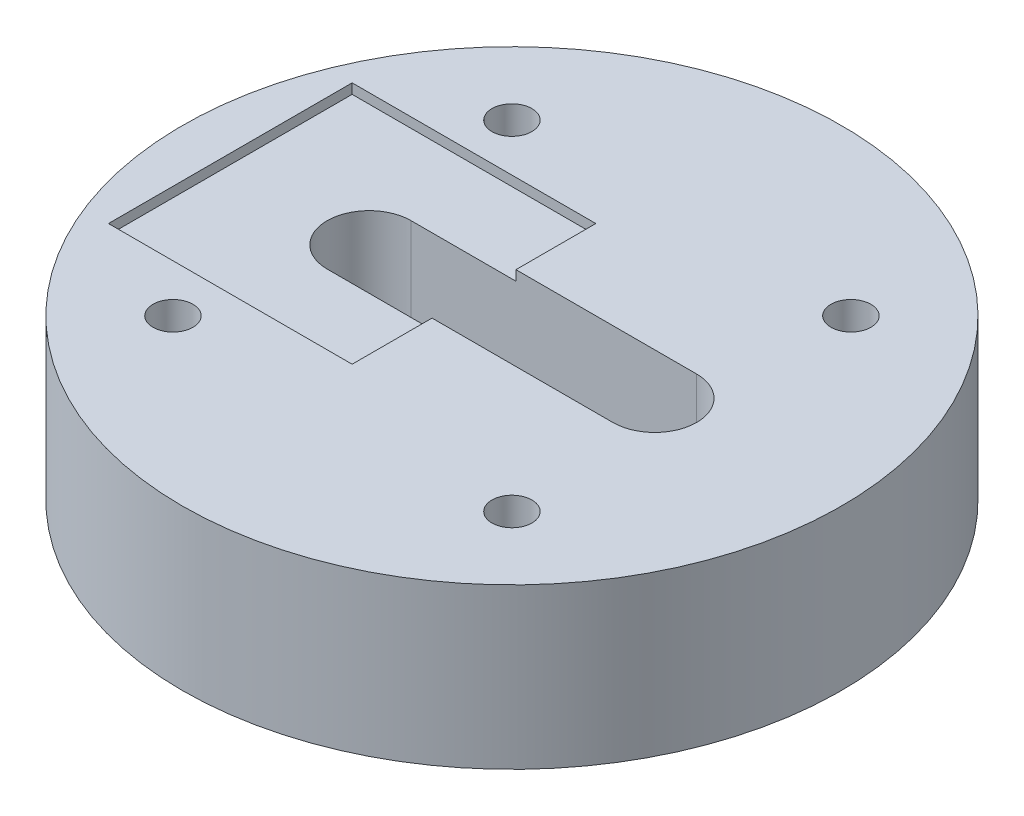
ISO-10303-21;
HEADER;
FILE_DESCRIPTION(('STEP AP214'),'2;1');
FILE_NAME('part.step','',(''),(''),'','','');
FILE_SCHEMA(('AUTOMOTIVE_DESIGN { 1 0 10303 214 1 1 1 1 }'));
ENDSEC;
DATA;
#1=APPLICATION_CONTEXT('core data for automotive mechanical design processes');
#2=APPLICATION_PROTOCOL_DEFINITION('international standard','automotive_design',2000,#1);
#3=PRODUCT_CONTEXT('',#1,'mechanical');
#4=PRODUCT('Part','Part','',(#3));
#5=PRODUCT_RELATED_PRODUCT_CATEGORY('part','',(#4));
#6=PRODUCT_DEFINITION_FORMATION('','',#4);
#7=PRODUCT_DEFINITION_CONTEXT('part definition',#1,'design');
#8=PRODUCT_DEFINITION('design','',#6,#7);
#9=PRODUCT_DEFINITION_SHAPE('','',#8);
#10=(LENGTH_UNIT() NAMED_UNIT(*) SI_UNIT(.MILLI.,.METRE.));
#11=(NAMED_UNIT(*) PLANE_ANGLE_UNIT() SI_UNIT($,.RADIAN.));
#12=(NAMED_UNIT(*) SI_UNIT($,.STERADIAN.) SOLID_ANGLE_UNIT());
#13=UNCERTAINTY_MEASURE_WITH_UNIT(LENGTH_MEASURE(1.E-05),#10,'distance_accuracy_value','');
#14=(GEOMETRIC_REPRESENTATION_CONTEXT(3) GLOBAL_UNCERTAINTY_ASSIGNED_CONTEXT((#13)) GLOBAL_UNIT_ASSIGNED_CONTEXT((#10,
#11,#12)) REPRESENTATION_CONTEXT('',''));
#15=CARTESIAN_POINT('',(0.,0.,0.));
#16=DIRECTION('',(0.,0.,1.));
#17=DIRECTION('',(1.,0.,0.));
#18=AXIS2_PLACEMENT_3D('',#15,#16,#17);
#19=CARTESIAN_POINT('',(0.,8.,0.));
#20=DIRECTION('',(0.,1.,0.));
#21=DIRECTION('',(0.,0.,1.));
#22=AXIS2_PLACEMENT_3D('',#19,#20,#21);
#23=PLANE('',#22);
#24=CARTESIAN_POINT('',(-8.48528137423865,8.,8.48528137423849));
#25=DIRECTION('',(0.,-1.,0.));
#26=DIRECTION('',(1.,0.,0.));
#27=AXIS2_PLACEMENT_3D('',#24,#25,#26);
#28=CIRCLE('',#27,1.);
#29=CARTESIAN_POINT('',(-7.48528137423864,8.,8.4852813742385));
#30=VERTEX_POINT('',#29);
#31=EDGE_CURVE('E382',#30,#30,#28,.T.);
#32=ORIENTED_EDGE('',*,*,#31,.T.);
#33=EDGE_LOOP('',(#32));
#34=FACE_BOUND('',#33,.T.);
#35=CARTESIAN_POINT('',(-8.48528137423852,8.,-8.48528137423862));
#36=DIRECTION('',(0.,-1.,0.));
#37=DIRECTION('',(0.,0.,1.));
#38=AXIS2_PLACEMENT_3D('',#35,#36,#37);
#39=CIRCLE('',#38,1.);
#40=CARTESIAN_POINT('',(-8.48528137423852,8.,-7.48528137423861));
#41=VERTEX_POINT('',#40);
#42=EDGE_CURVE('E377',#41,#41,#39,.T.);
#43=ORIENTED_EDGE('',*,*,#42,.T.);
#44=EDGE_LOOP('',(#43));
#45=FACE_BOUND('',#44,.T.);
#46=CARTESIAN_POINT('',(8.4852813742387,8.,-8.48528137423843));
#47=DIRECTION('',(0.,-1.,0.));
#48=DIRECTION('',(-1.,0.,0.));
#49=AXIS2_PLACEMENT_3D('',#46,#47,#48);
#50=CIRCLE('',#49,1.);
#51=CARTESIAN_POINT('',(7.4852813742387,8.,-8.48528137423845));
#52=VERTEX_POINT('',#51);
#53=EDGE_CURVE('E373',#52,#52,#50,.T.);
#54=ORIENTED_EDGE('',*,*,#53,.T.);
#55=EDGE_LOOP('',(#54));
#56=FACE_BOUND('',#55,.T.);
#57=CARTESIAN_POINT('',(8.48528137423852,8.,8.48528137423862));
#58=DIRECTION('',(0.,-1.,0.));
#59=DIRECTION('',(0.,0.,-1.));
#60=AXIS2_PLACEMENT_3D('',#57,#58,#59);
#61=CIRCLE('',#60,1.);
#62=CARTESIAN_POINT('',(8.48528137423852,8.,7.48528137423861));
#63=VERTEX_POINT('',#62);
#64=EDGE_CURVE('E363',#63,#63,#61,.T.);
#65=ORIENTED_EDGE('',*,*,#64,.T.);
#66=EDGE_LOOP('',(#65));
#67=FACE_BOUND('',#66,.T.);
#68=CARTESIAN_POINT('',(0.,8.,0.));
#69=DIRECTION('',(0.,1.,0.));
#70=DIRECTION('',(0.,0.,1.));
#71=AXIS2_PLACEMENT_3D('',#68,#69,#70);
#72=CIRCLE('',#71,16.5);
#73=CARTESIAN_POINT('',(0.,8.,16.5));
#74=VERTEX_POINT('',#73);
#75=EDGE_CURVE('E352',#74,#74,#72,.T.);
#76=ORIENTED_EDGE('',*,*,#75,.T.);
#77=EDGE_LOOP('',(#76));
#78=FACE_BOUND('',#77,.T.);
#79=DIRECTION('',(-1.,0.,0.));
#80=VECTOR('',#79,1.);
#81=CARTESIAN_POINT('',(4.25,8.,2.1));
#82=LINE('',#81,#80);
#83=CARTESIAN_POINT('',(7.15,8.,2.1));
#84=VERTEX_POINT('',#83);
#85=CARTESIAN_POINT('',(-1.90000000000001,8.,2.1));
#86=VERTEX_POINT('',#85);
#87=EDGE_CURVE('E321',#84,#86,#82,.T.);
#88=ORIENTED_EDGE('',*,*,#87,.T.);
#89=DIRECTION('',(0.,0.,1.));
#90=VECTOR('',#89,1.);
#91=CARTESIAN_POINT('',(-1.90000000000001,8.,-6.10000000000002));
#92=LINE('',#91,#90);
#93=CARTESIAN_POINT('',(-1.9,8.,6.10000000000002));
#94=VERTEX_POINT('',#93);
#95=EDGE_CURVE('E392',#86,#94,#92,.T.);
#96=ORIENTED_EDGE('',*,*,#95,.T.);
#97=DIRECTION('',(-1.,0.,0.));
#98=VECTOR('',#97,1.);
#99=CARTESIAN_POINT('',(-1.9,8.,6.10000000000002));
#100=LINE('',#99,#98);
#101=CARTESIAN_POINT('',(-14.1,8.,6.10000000000002));
#102=VERTEX_POINT('',#101);
#103=EDGE_CURVE('E267',#94,#102,#100,.T.);
#104=ORIENTED_EDGE('',*,*,#103,.T.);
#105=DIRECTION('',(0.,0.,1.));
#106=VECTOR('',#105,1.);
#107=CARTESIAN_POINT('',(-14.1,8.,-6.10000000000002));
#108=LINE('',#107,#106);
#109=CARTESIAN_POINT('',(-14.1,8.,-6.10000000000002));
#110=VERTEX_POINT('',#109);
#111=EDGE_CURVE('E403',#110,#102,#108,.T.);
#112=ORIENTED_EDGE('',*,*,#111,.F.);
#113=DIRECTION('',(-1.,0.,0.));
#114=VECTOR('',#113,1.);
#115=CARTESIAN_POINT('',(-1.90000000000001,8.,-6.10000000000002));
#116=LINE('',#115,#114);
#117=CARTESIAN_POINT('',(-1.90000000000001,8.,-6.10000000000002));
#118=VERTEX_POINT('',#117);
#119=EDGE_CURVE('E254',#118,#110,#116,.T.);
#120=ORIENTED_EDGE('',*,*,#119,.F.);
#121=CARTESIAN_POINT('',(-1.90000000000001,8.,-2.1));
#122=VERTEX_POINT('',#121);
#123=EDGE_CURVE('E399',#118,#122,#92,.T.);
#124=ORIENTED_EDGE('',*,*,#123,.T.);
#125=DIRECTION('',(-1.,0.,0.));
#126=VECTOR('',#125,1.);
#127=CARTESIAN_POINT('',(4.25,8.,-2.1));
#128=LINE('',#127,#126);
#129=CARTESIAN_POINT('',(7.15,8.,-2.1));
#130=VERTEX_POINT('',#129);
#131=EDGE_CURVE('E345',#130,#122,#128,.T.);
#132=ORIENTED_EDGE('',*,*,#131,.F.);
#133=CARTESIAN_POINT('',(7.15000000000001,8.,0.));
#134=DIRECTION('',(0.,1.,0.));
#135=DIRECTION('',(0.,0.,1.));
#136=AXIS2_PLACEMENT_3D('',#133,#134,#135);
#137=CIRCLE('',#136,2.1);
#138=EDGE_CURVE('E301',#84,#130,#137,.T.);
#139=ORIENTED_EDGE('',*,*,#138,.F.);
#140=EDGE_LOOP('',(#88,#96,#104,#112,#120,#124,#132,#139));
#141=FACE_BOUND('',#140,.T.);
#142=ADVANCED_FACE('F143',(#34,#45,#56,#67,#78,#141),#23,.T.);
#143=CARTESIAN_POINT('',(-4.25,0.,0.));
#144=DIRECTION('',(0.,1.,0.));
#145=DIRECTION('',(0.,0.,1.));
#146=AXIS2_PLACEMENT_3D('',#143,#144,#145);
#147=CYLINDRICAL_SURFACE('',#146,2.1);
#148=CARTESIAN_POINT('',(-4.25,2.,0.));
#149=DIRECTION('',(0.,1.,0.));
#150=DIRECTION('',(0.,0.,1.));
#151=AXIS2_PLACEMENT_3D('',#148,#149,#150);
#152=CIRCLE('',#151,2.1);
#153=CARTESIAN_POINT('',(-4.25,2.,2.1));
#154=VERTEX_POINT('',#153);
#155=CARTESIAN_POINT('',(-4.25,2.,-2.1));
#156=VERTEX_POINT('',#155);
#157=EDGE_CURVE('E319',#154,#156,#152,.F.);
#158=ORIENTED_EDGE('',*,*,#157,.F.);
#159=DIRECTION('',(0.,1.,0.));
#160=VECTOR('',#159,1.);
#161=CARTESIAN_POINT('',(-4.25,0.,2.1));
#162=LINE('',#161,#160);
#163=CARTESIAN_POINT('',(-4.25,0.,2.1));
#164=VERTEX_POINT('',#163);
#165=EDGE_CURVE('E327',#164,#154,#162,.T.);
#166=ORIENTED_EDGE('',*,*,#165,.F.);
#167=CARTESIAN_POINT('',(-4.25,0.,0.));
#168=DIRECTION('',(0.,1.,0.));
#169=DIRECTION('',(0.,0.,1.));
#170=AXIS2_PLACEMENT_3D('',#167,#168,#169);
#171=CIRCLE('',#170,2.1);
#172=CARTESIAN_POINT('',(-4.25,0.,-2.1));
#173=VERTEX_POINT('',#172);
#174=EDGE_CURVE('E322',#173,#164,#171,.T.);
#175=ORIENTED_EDGE('',*,*,#174,.F.);
#176=DIRECTION('',(0.,1.,0.));
#177=VECTOR('',#176,1.);
#178=CARTESIAN_POINT('',(-4.25,0.,-2.1));
#179=LINE('',#178,#177);
#180=EDGE_CURVE('E325',#173,#156,#179,.T.);
#181=ORIENTED_EDGE('',*,*,#180,.T.);
#182=EDGE_LOOP('',(#158,#166,#175,#181));
#183=FACE_BOUND('',#182,.T.);
#184=ADVANCED_FACE('F448',(#183),#147,.F.);
#185=CARTESIAN_POINT('',(4.25,0.,0.));
#186=DIRECTION('',(0.,1.,0.));
#187=DIRECTION('',(0.,0.,1.));
#188=AXIS2_PLACEMENT_3D('',#185,#186,#187);
#189=CYLINDRICAL_SURFACE('',#188,2.1);
#190=CARTESIAN_POINT('',(4.25,2.,0.));
#191=DIRECTION('',(0.,1.,0.));
#192=DIRECTION('',(0.,0.,1.));
#193=AXIS2_PLACEMENT_3D('',#190,#191,#192);
#194=CIRCLE('',#193,2.1);
#195=CARTESIAN_POINT('',(4.25,2.,-2.1));
#196=VERTEX_POINT('',#195);
#197=CARTESIAN_POINT('',(4.25,2.,2.1));
#198=VERTEX_POINT('',#197);
#199=EDGE_CURVE('E300',#196,#198,#194,.F.);
#200=ORIENTED_EDGE('',*,*,#199,.F.);
#201=DIRECTION('',(0.,1.,0.));
#202=VECTOR('',#201,1.);
#203=CARTESIAN_POINT('',(4.25,0.,-2.1));
#204=LINE('',#203,#202);
#205=CARTESIAN_POINT('',(4.25,0.,-2.1));
#206=VERTEX_POINT('',#205);
#207=EDGE_CURVE('E326',#206,#196,#204,.T.);
#208=ORIENTED_EDGE('',*,*,#207,.F.);
#209=CARTESIAN_POINT('',(4.25,0.,0.));
#210=DIRECTION('',(0.,1.,0.));
#211=DIRECTION('',(0.,0.,1.));
#212=AXIS2_PLACEMENT_3D('',#209,#210,#211);
#213=CIRCLE('',#212,2.1);
#214=CARTESIAN_POINT('',(4.25,0.,2.1));
#215=VERTEX_POINT('',#214);
#216=EDGE_CURVE('E333',#215,#206,#213,.T.);
#217=ORIENTED_EDGE('',*,*,#216,.F.);
#218=DIRECTION('',(0.,1.,0.));
#219=VECTOR('',#218,1.);
#220=CARTESIAN_POINT('',(4.25,0.,2.1));
#221=LINE('',#220,#219);
#222=EDGE_CURVE('E336',#215,#198,#221,.T.);
#223=ORIENTED_EDGE('',*,*,#222,.T.);
#224=EDGE_LOOP('',(#200,#208,#217,#223));
#225=FACE_BOUND('',#224,.T.);
#226=ADVANCED_FACE('F441',(#225),#189,.F.);
#227=CARTESIAN_POINT('',(0.,0.,0.));
#228=DIRECTION('',(0.,1.,0.));
#229=DIRECTION('',(0.,0.,1.));
#230=AXIS2_PLACEMENT_3D('',#227,#228,#229);
#231=PLANE('',#230);
#232=CARTESIAN_POINT('',(-8.48528137423865,0.,8.48528137423849));
#233=DIRECTION('',(0.,-1.,0.));
#234=DIRECTION('',(1.,0.,0.));
#235=AXIS2_PLACEMENT_3D('',#232,#233,#234);
#236=CIRCLE('',#235,1.5);
#237=CARTESIAN_POINT('',(-6.98528137423865,0.,8.4852813742385));
#238=VERTEX_POINT('',#237);
#239=EDGE_CURVE('E473',#238,#238,#236,.T.);
#240=ORIENTED_EDGE('',*,*,#239,.F.);
#241=EDGE_LOOP('',(#240));
#242=FACE_BOUND('',#241,.T.);
#243=CARTESIAN_POINT('',(-8.48528137423852,0.,-8.48528137423862));
#244=DIRECTION('',(0.,-1.,0.));
#245=DIRECTION('',(0.,0.,1.));
#246=AXIS2_PLACEMENT_3D('',#243,#244,#245);
#247=CIRCLE('',#246,1.5);
#248=CARTESIAN_POINT('',(-8.48528137423852,0.,-9.98528137423862));
#249=VERTEX_POINT('',#248);
#250=EDGE_CURVE('E477',#249,#249,#247,.T.);
#251=ORIENTED_EDGE('',*,*,#250,.F.);
#252=EDGE_LOOP('',(#251));
#253=FACE_BOUND('',#252,.T.);
#254=CARTESIAN_POINT('',(8.4852813742387,0.,-8.48528137423843));
#255=DIRECTION('',(0.,-1.,0.));
#256=DIRECTION('',(-1.,0.,0.));
#257=AXIS2_PLACEMENT_3D('',#254,#255,#256);
#258=CIRCLE('',#257,1.5);
#259=CARTESIAN_POINT('',(6.9852813742387,0.,-8.48528137423845));
#260=VERTEX_POINT('',#259);
#261=EDGE_CURVE('E481',#260,#260,#258,.T.);
#262=ORIENTED_EDGE('',*,*,#261,.F.);
#263=EDGE_LOOP('',(#262));
#264=FACE_BOUND('',#263,.T.);
#265=CARTESIAN_POINT('',(8.48528137423852,0.,8.48528137423862));
#266=DIRECTION('',(0.,-1.,0.));
#267=DIRECTION('',(0.,0.,-1.));
#268=AXIS2_PLACEMENT_3D('',#265,#266,#267);
#269=CIRCLE('',#268,1.5);
#270=CARTESIAN_POINT('',(8.48528137423852,0.,6.98528137423862));
#271=VERTEX_POINT('',#270);
#272=EDGE_CURVE('E386',#271,#271,#269,.T.);
#273=ORIENTED_EDGE('',*,*,#272,.F.);
#274=EDGE_LOOP('',(#273));
#275=FACE_BOUND('',#274,.T.);
#276=CARTESIAN_POINT('',(-7.69999999999998,0.,0.));
#277=DIRECTION('',(0.,1.,0.));
#278=DIRECTION('',(0.,0.,1.));
#279=AXIS2_PLACEMENT_3D('',#276,#277,#278);
#280=CIRCLE('',#279,0.4);
#281=CARTESIAN_POINT('',(-7.69999999999998,0.,0.400000000000003));
#282=VERTEX_POINT('',#281);
#283=EDGE_CURVE('E279',#282,#282,#280,.T.);
#284=ORIENTED_EDGE('',*,*,#283,.T.);
#285=EDGE_LOOP('',(#284));
#286=FACE_BOUND('',#285,.T.);
#287=CARTESIAN_POINT('',(7.70000000000002,0.,0.));
#288=DIRECTION('',(0.,1.,0.));
#289=DIRECTION('',(0.,0.,1.));
#290=AXIS2_PLACEMENT_3D('',#287,#288,#289);
#291=CIRCLE('',#290,0.4);
#292=CARTESIAN_POINT('',(7.70000000000002,0.,0.4));
#293=VERTEX_POINT('',#292);
#294=EDGE_CURVE('E278',#293,#293,#291,.T.);
#295=ORIENTED_EDGE('',*,*,#294,.T.);
#296=EDGE_LOOP('',(#295));
#297=FACE_BOUND('',#296,.T.);
#298=CARTESIAN_POINT('',(0.,0.,0.));
#299=DIRECTION('',(0.,1.,0.));
#300=DIRECTION('',(0.,0.,1.));
#301=AXIS2_PLACEMENT_3D('',#298,#299,#300);
#302=CIRCLE('',#301,16.5);
#303=CARTESIAN_POINT('',(0.,0.,16.5));
#304=VERTEX_POINT('',#303);
#305=EDGE_CURVE('E330',#304,#304,#302,.T.);
#306=ORIENTED_EDGE('',*,*,#305,.F.);
#307=EDGE_LOOP('',(#306));
#308=FACE_BOUND('',#307,.T.);
#309=DIRECTION('',(-1.,0.,0.));
#310=VECTOR('',#309,1.);
#311=CARTESIAN_POINT('',(4.25,0.,2.1));
#312=LINE('',#311,#310);
#313=EDGE_CURVE('E342',#215,#164,#312,.T.);
#314=ORIENTED_EDGE('',*,*,#313,.F.);
#315=ORIENTED_EDGE('',*,*,#216,.T.);
#316=DIRECTION('',(-1.,0.,0.));
#317=VECTOR('',#316,1.);
#318=CARTESIAN_POINT('',(4.25,0.,-2.1));
#319=LINE('',#318,#317);
#320=EDGE_CURVE('E337',#206,#173,#319,.T.);
#321=ORIENTED_EDGE('',*,*,#320,.T.);
#322=ORIENTED_EDGE('',*,*,#174,.T.);
#323=EDGE_LOOP('',(#314,#315,#321,#322));
#324=FACE_BOUND('',#323,.T.);
#325=ADVANCED_FACE('F446',(#242,#253,#264,#275,#286,#297,#308,#324),#231,.F.);
#326=CARTESIAN_POINT('',(0.,8.,0.));
#327=DIRECTION('',(0.,-1.,0.));
#328=DIRECTION('',(0.,0.,-1.));
#329=AXIS2_PLACEMENT_3D('',#326,#327,#328);
#330=CYLINDRICAL_SURFACE('',#329,16.5);
#331=ORIENTED_EDGE('',*,*,#75,.F.);
#332=EDGE_LOOP('',(#331));
#333=FACE_BOUND('',#332,.T.);
#334=ORIENTED_EDGE('',*,*,#305,.T.);
#335=EDGE_LOOP('',(#334));
#336=FACE_BOUND('',#335,.T.);
#337=ADVANCED_FACE('F145',(#333,#336),#330,.T.);
#338=CARTESIAN_POINT('',(4.25,0.,2.1));
#339=DIRECTION('',(0.,0.,-1.));
#340=DIRECTION('',(-1.,0.,0.));
#341=AXIS2_PLACEMENT_3D('',#338,#339,#340);
#342=PLANE('',#341);
#343=DIRECTION('',(-1.,0.,0.));
#344=VECTOR('',#343,1.);
#345=CARTESIAN_POINT('',(4.25,7.5,2.1));
#346=LINE('',#345,#344);
#347=CARTESIAN_POINT('',(-1.90000000000001,7.5,2.1));
#348=VERTEX_POINT('',#347);
#349=CARTESIAN_POINT('',(-7.15,7.5,2.1));
#350=VERTEX_POINT('',#349);
#351=EDGE_CURVE('E160',#348,#350,#346,.T.);
#352=ORIENTED_EDGE('',*,*,#351,.F.);
#353=DIRECTION('',(0.,1.,0.));
#354=VECTOR('',#353,1.);
#355=CARTESIAN_POINT('',(-1.90000000000001,0.,2.1));
#356=LINE('',#355,#354);
#357=EDGE_CURVE('E13',#348,#86,#356,.T.);
#358=ORIENTED_EDGE('',*,*,#357,.T.);
#359=ORIENTED_EDGE('',*,*,#87,.F.);
#360=DIRECTION('',(0.,1.,0.));
#361=VECTOR('',#360,1.);
#362=CARTESIAN_POINT('',(7.15,-14.9040263016408,2.1));
#363=LINE('',#362,#361);
#364=CARTESIAN_POINT('',(7.15000000000001,2.,2.1));
#365=VERTEX_POINT('',#364);
#366=EDGE_CURVE('E304',#365,#84,#363,.T.);
#367=ORIENTED_EDGE('',*,*,#366,.F.);
#368=DIRECTION('',(-1.,0.,0.));
#369=VECTOR('',#368,1.);
#370=CARTESIAN_POINT('',(-7.15,2.,2.1));
#371=LINE('',#370,#369);
#372=EDGE_CURVE('E305',#365,#198,#371,.T.);
#373=ORIENTED_EDGE('',*,*,#372,.T.);
#374=ORIENTED_EDGE('',*,*,#222,.F.);
#375=ORIENTED_EDGE('',*,*,#313,.T.);
#376=ORIENTED_EDGE('',*,*,#165,.T.);
#377=CARTESIAN_POINT('',(-7.15,2.,2.1));
#378=VERTEX_POINT('',#377);
#379=EDGE_CURVE('E315',#154,#378,#371,.T.);
#380=ORIENTED_EDGE('',*,*,#379,.T.);
#381=DIRECTION('',(0.,1.,0.));
#382=VECTOR('',#381,1.);
#383=CARTESIAN_POINT('',(-7.15,-14.9040263016408,2.1));
#384=LINE('',#383,#382);
#385=EDGE_CURVE('E290',#378,#350,#384,.T.);
#386=ORIENTED_EDGE('',*,*,#385,.T.);
#387=EDGE_LOOP('',(#352,#358,#359,#367,#373,#374,#375,#376,#380,#386));
#388=FACE_BOUND('',#387,.T.);
#389=ADVANCED_FACE('F419',(#388),#342,.T.);
#390=CARTESIAN_POINT('',(4.25,0.,-2.1));
#391=DIRECTION('',(0.,0.,-1.));
#392=DIRECTION('',(-1.,0.,0.));
#393=AXIS2_PLACEMENT_3D('',#390,#391,#392);
#394=PLANE('',#393);
#395=DIRECTION('',(0.,1.,0.));
#396=VECTOR('',#395,1.);
#397=CARTESIAN_POINT('',(-1.90000000000001,0.,-2.1));
#398=LINE('',#397,#396);
#399=CARTESIAN_POINT('',(-1.90000000000001,7.5,-2.1));
#400=VERTEX_POINT('',#399);
#401=EDGE_CURVE('E152',#400,#122,#398,.T.);
#402=ORIENTED_EDGE('',*,*,#401,.F.);
#403=DIRECTION('',(-1.,0.,0.));
#404=VECTOR('',#403,1.);
#405=CARTESIAN_POINT('',(4.25,7.5,-2.1));
#406=LINE('',#405,#404);
#407=CARTESIAN_POINT('',(-7.14999999999999,7.5,-2.1));
#408=VERTEX_POINT('',#407);
#409=EDGE_CURVE('E268',#400,#408,#406,.T.);
#410=ORIENTED_EDGE('',*,*,#409,.T.);
#411=DIRECTION('',(0.,1.,0.));
#412=VECTOR('',#411,1.);
#413=CARTESIAN_POINT('',(-7.15,-14.9040263016408,-2.1));
#414=LINE('',#413,#412);
#415=CARTESIAN_POINT('',(-7.15,2.,-2.1));
#416=VERTEX_POINT('',#415);
#417=EDGE_CURVE('E294',#416,#408,#414,.T.);
#418=ORIENTED_EDGE('',*,*,#417,.F.);
#419=DIRECTION('',(-1.,0.,0.));
#420=VECTOR('',#419,1.);
#421=CARTESIAN_POINT('',(-7.15,2.,-2.1));
#422=LINE('',#421,#420);
#423=EDGE_CURVE('E168',#156,#416,#422,.T.);
#424=ORIENTED_EDGE('',*,*,#423,.F.);
#425=ORIENTED_EDGE('',*,*,#180,.F.);
#426=ORIENTED_EDGE('',*,*,#320,.F.);
#427=ORIENTED_EDGE('',*,*,#207,.T.);
#428=CARTESIAN_POINT('',(7.15,2.,-2.1));
#429=VERTEX_POINT('',#428);
#430=EDGE_CURVE('E313',#429,#196,#422,.T.);
#431=ORIENTED_EDGE('',*,*,#430,.F.);
#432=DIRECTION('',(0.,1.,0.));
#433=VECTOR('',#432,1.);
#434=CARTESIAN_POINT('',(7.15,-14.9040263016408,-2.1));
#435=LINE('',#434,#433);
#436=EDGE_CURVE('E306',#429,#130,#435,.T.);
#437=ORIENTED_EDGE('',*,*,#436,.T.);
#438=ORIENTED_EDGE('',*,*,#131,.T.);
#439=EDGE_LOOP('',(#402,#410,#418,#424,#425,#426,#427,#431,#437,#438));
#440=FACE_BOUND('',#439,.T.);
#441=ADVANCED_FACE('F428',(#440),#394,.F.);
#442=CARTESIAN_POINT('',(0.,2.,0.));
#443=DIRECTION('',(0.,1.,0.));
#444=DIRECTION('',(0.,0.,1.));
#445=AXIS2_PLACEMENT_3D('',#442,#443,#444);
#446=PLANE('',#445);
#447=CARTESIAN_POINT('',(7.70000000000002,2.,0.));
#448=DIRECTION('',(0.,1.,0.));
#449=DIRECTION('',(0.,0.,1.));
#450=AXIS2_PLACEMENT_3D('',#447,#448,#449);
#451=CIRCLE('',#450,0.4);
#452=CARTESIAN_POINT('',(7.70000000000002,2.,0.4));
#453=VERTEX_POINT('',#452);
#454=EDGE_CURVE('E285',#453,#453,#451,.T.);
#455=ORIENTED_EDGE('',*,*,#454,.F.);
#456=EDGE_LOOP('',(#455));
#457=FACE_BOUND('',#456,.T.);
#458=ORIENTED_EDGE('',*,*,#199,.T.);
#459=ORIENTED_EDGE('',*,*,#372,.F.);
#460=CARTESIAN_POINT('',(7.15000000000001,2.,0.));
#461=DIRECTION('',(0.,1.,0.));
#462=DIRECTION('',(0.,0.,1.));
#463=AXIS2_PLACEMENT_3D('',#460,#461,#462);
#464=CIRCLE('',#463,2.1);
#465=EDGE_CURVE('E297',#429,#365,#464,.F.);
#466=ORIENTED_EDGE('',*,*,#465,.F.);
#467=ORIENTED_EDGE('',*,*,#430,.T.);
#468=EDGE_LOOP('',(#458,#459,#466,#467));
#469=FACE_BOUND('',#468,.T.);
#470=ADVANCED_FACE('F438',(#457,#469),#446,.T.);
#471=CARTESIAN_POINT('',(7.15000000000001,-14.9040263016408,0.));
#472=DIRECTION('',(0.,1.,0.));
#473=DIRECTION('',(0.,0.,1.));
#474=AXIS2_PLACEMENT_3D('',#471,#472,#473);
#475=CYLINDRICAL_SURFACE('',#474,2.1);
#476=ORIENTED_EDGE('',*,*,#465,.T.);
#477=ORIENTED_EDGE('',*,*,#366,.T.);
#478=ORIENTED_EDGE('',*,*,#138,.T.);
#479=ORIENTED_EDGE('',*,*,#436,.F.);
#480=EDGE_LOOP('',(#476,#477,#478,#479));
#481=FACE_BOUND('',#480,.T.);
#482=ADVANCED_FACE('F435',(#481),#475,.F.);
#483=CARTESIAN_POINT('',(-7.69999999999998,2.,0.));
#484=DIRECTION('',(0.,1.,0.));
#485=DIRECTION('',(0.,0.,1.));
#486=AXIS2_PLACEMENT_3D('',#483,#484,#485);
#487=CIRCLE('',#486,0.4);
#488=CARTESIAN_POINT('',(-7.69999999999998,2.,0.400000000000003));
#489=VERTEX_POINT('',#488);
#490=EDGE_CURVE('E282',#489,#489,#487,.T.);
#491=ORIENTED_EDGE('',*,*,#490,.F.);
#492=EDGE_LOOP('',(#491));
#493=FACE_BOUND('',#492,.T.);
#494=ORIENTED_EDGE('',*,*,#157,.T.);
#495=ORIENTED_EDGE('',*,*,#423,.T.);
#496=CARTESIAN_POINT('',(-7.14999999999999,2.,0.));
#497=DIRECTION('',(0.,1.,0.));
#498=DIRECTION('',(0.,0.,1.));
#499=AXIS2_PLACEMENT_3D('',#496,#497,#498);
#500=CIRCLE('',#499,2.1);
#501=EDGE_CURVE('E293',#378,#416,#500,.F.);
#502=ORIENTED_EDGE('',*,*,#501,.F.);
#503=ORIENTED_EDGE('',*,*,#379,.F.);
#504=EDGE_LOOP('',(#494,#495,#502,#503));
#505=FACE_BOUND('',#504,.T.);
#506=ADVANCED_FACE('F425',(#493,#505),#446,.T.);
#507=CARTESIAN_POINT('',(-7.14999999999999,-14.9040263016408,0.));
#508=DIRECTION('',(0.,1.,0.));
#509=DIRECTION('',(0.,0.,1.));
#510=AXIS2_PLACEMENT_3D('',#507,#508,#509);
#511=CYLINDRICAL_SURFACE('',#510,2.1);
#512=ORIENTED_EDGE('',*,*,#417,.T.);
#513=CARTESIAN_POINT('',(-7.14999999999999,7.5,0.));
#514=DIRECTION('',(0.,-1.,0.));
#515=DIRECTION('',(0.,0.,-1.));
#516=AXIS2_PLACEMENT_3D('',#513,#514,#515);
#517=CIRCLE('',#516,2.1);
#518=EDGE_CURVE('E355',#408,#350,#517,.F.);
#519=ORIENTED_EDGE('',*,*,#518,.T.);
#520=ORIENTED_EDGE('',*,*,#385,.F.);
#521=ORIENTED_EDGE('',*,*,#501,.T.);
#522=EDGE_LOOP('',(#512,#519,#520,#521));
#523=FACE_BOUND('',#522,.T.);
#524=ADVANCED_FACE('F423',(#523),#511,.F.);
#525=CARTESIAN_POINT('',(-7.69999999999998,0.,0.));
#526=DIRECTION('',(0.,1.,0.));
#527=DIRECTION('',(0.,0.,1.));
#528=AXIS2_PLACEMENT_3D('',#525,#526,#527);
#529=CYLINDRICAL_SURFACE('',#528,0.4);
#530=ORIENTED_EDGE('',*,*,#283,.F.);
#531=EDGE_LOOP('',(#530));
#532=FACE_BOUND('',#531,.T.);
#533=ORIENTED_EDGE('',*,*,#490,.T.);
#534=EDGE_LOOP('',(#533));
#535=FACE_BOUND('',#534,.T.);
#536=ADVANCED_FACE('F494',(#532,#535),#529,.F.);
#537=CARTESIAN_POINT('',(7.70000000000002,0.,0.));
#538=DIRECTION('',(0.,1.,0.));
#539=DIRECTION('',(0.,0.,1.));
#540=AXIS2_PLACEMENT_3D('',#537,#538,#539);
#541=CYLINDRICAL_SURFACE('',#540,0.4);
#542=ORIENTED_EDGE('',*,*,#294,.F.);
#543=EDGE_LOOP('',(#542));
#544=FACE_BOUND('',#543,.T.);
#545=ORIENTED_EDGE('',*,*,#454,.T.);
#546=EDGE_LOOP('',(#545));
#547=FACE_BOUND('',#546,.T.);
#548=ADVANCED_FACE('F491',(#544,#547),#541,.F.);
#549=CARTESIAN_POINT('',(-1.90000000000001,7.5,-6.10000000000002));
#550=DIRECTION('',(-1.,0.,0.));
#551=DIRECTION('',(0.,0.,1.));
#552=AXIS2_PLACEMENT_3D('',#549,#550,#551);
#553=PLANE('',#552);
#554=ORIENTED_EDGE('',*,*,#401,.T.);
#555=ORIENTED_EDGE('',*,*,#123,.F.);
#556=DIRECTION('',(0.,1.,0.));
#557=VECTOR('',#556,1.);
#558=CARTESIAN_POINT('',(-1.90000000000001,7.5,-6.10000000000002));
#559=LINE('',#558,#557);
#560=CARTESIAN_POINT('',(-1.90000000000001,7.5,-6.10000000000002));
#561=VERTEX_POINT('',#560);
#562=EDGE_CURVE('E398',#561,#118,#559,.T.);
#563=ORIENTED_EDGE('',*,*,#562,.F.);
#564=DIRECTION('',(0.,0.,1.));
#565=VECTOR('',#564,1.);
#566=CARTESIAN_POINT('',(-1.90000000000001,7.5,-6.10000000000002));
#567=LINE('',#566,#565);
#568=EDGE_CURVE('E253',#561,#400,#567,.T.);
#569=ORIENTED_EDGE('',*,*,#568,.T.);
#570=EDGE_LOOP('',(#554,#555,#563,#569));
#571=FACE_BOUND('',#570,.T.);
#572=ADVANCED_FACE('F431',(#571),#553,.T.);
#573=CARTESIAN_POINT('',(-14.1,7.5,-6.10000000000002));
#574=DIRECTION('',(-1.,0.,0.));
#575=DIRECTION('',(0.,0.,1.));
#576=AXIS2_PLACEMENT_3D('',#573,#574,#575);
#577=PLANE('',#576);
#578=ORIENTED_EDGE('',*,*,#111,.T.);
#579=DIRECTION('',(0.,1.,0.));
#580=VECTOR('',#579,1.);
#581=CARTESIAN_POINT('',(-14.1,7.5,6.10000000000002));
#582=LINE('',#581,#580);
#583=CARTESIAN_POINT('',(-14.1,7.5,6.10000000000002));
#584=VERTEX_POINT('',#583);
#585=EDGE_CURVE('E269',#584,#102,#582,.T.);
#586=ORIENTED_EDGE('',*,*,#585,.F.);
#587=DIRECTION('',(0.,0.,1.));
#588=VECTOR('',#587,1.);
#589=CARTESIAN_POINT('',(-14.1,7.5,-6.10000000000002));
#590=LINE('',#589,#588);
#591=CARTESIAN_POINT('',(-14.1,7.5,-6.10000000000002));
#592=VERTEX_POINT('',#591);
#593=EDGE_CURVE('E261',#592,#584,#590,.T.);
#594=ORIENTED_EDGE('',*,*,#593,.F.);
#595=DIRECTION('',(0.,1.,0.));
#596=VECTOR('',#595,1.);
#597=CARTESIAN_POINT('',(-14.1,7.5,-6.10000000000002));
#598=LINE('',#597,#596);
#599=EDGE_CURVE('E273',#592,#110,#598,.T.);
#600=ORIENTED_EDGE('',*,*,#599,.T.);
#601=EDGE_LOOP('',(#578,#586,#594,#600));
#602=FACE_BOUND('',#601,.T.);
#603=ADVANCED_FACE('F409',(#602),#577,.F.);
#604=CARTESIAN_POINT('',(-1.90000000000001,7.5,-6.10000000000002));
#605=DIRECTION('',(0.,0.,-1.));
#606=DIRECTION('',(-1.,0.,0.));
#607=AXIS2_PLACEMENT_3D('',#604,#605,#606);
#608=PLANE('',#607);
#609=ORIENTED_EDGE('',*,*,#119,.T.);
#610=ORIENTED_EDGE('',*,*,#599,.F.);
#611=DIRECTION('',(-1.,0.,0.));
#612=VECTOR('',#611,1.);
#613=CARTESIAN_POINT('',(-1.90000000000001,7.5,-6.10000000000002));
#614=LINE('',#613,#612);
#615=EDGE_CURVE('E396',#561,#592,#614,.T.);
#616=ORIENTED_EDGE('',*,*,#615,.F.);
#617=ORIENTED_EDGE('',*,*,#562,.T.);
#618=EDGE_LOOP('',(#609,#610,#616,#617));
#619=FACE_BOUND('',#618,.T.);
#620=ADVANCED_FACE('F414',(#619),#608,.F.);
#621=CARTESIAN_POINT('',(-1.9,7.5,6.10000000000002));
#622=DIRECTION('',(0.,0.,-1.));
#623=DIRECTION('',(-1.,0.,0.));
#624=AXIS2_PLACEMENT_3D('',#621,#622,#623);
#625=PLANE('',#624);
#626=ORIENTED_EDGE('',*,*,#103,.F.);
#627=DIRECTION('',(0.,1.,0.));
#628=VECTOR('',#627,1.);
#629=CARTESIAN_POINT('',(-1.9,7.5,6.10000000000002));
#630=LINE('',#629,#628);
#631=CARTESIAN_POINT('',(-1.9,7.5,6.10000000000002));
#632=VERTEX_POINT('',#631);
#633=EDGE_CURVE('E251',#632,#94,#630,.T.);
#634=ORIENTED_EDGE('',*,*,#633,.F.);
#635=DIRECTION('',(-1.,0.,0.));
#636=VECTOR('',#635,1.);
#637=CARTESIAN_POINT('',(-1.9,7.5,6.10000000000002));
#638=LINE('',#637,#636);
#639=EDGE_CURVE('E257',#632,#584,#638,.T.);
#640=ORIENTED_EDGE('',*,*,#639,.T.);
#641=ORIENTED_EDGE('',*,*,#585,.T.);
#642=EDGE_LOOP('',(#626,#634,#640,#641));
#643=FACE_BOUND('',#642,.T.);
#644=ADVANCED_FACE('F265',(#643),#625,.T.);
#645=CARTESIAN_POINT('',(0.,7.5,0.));
#646=DIRECTION('',(0.,-1.,0.));
#647=DIRECTION('',(0.,0.,-1.));
#648=AXIS2_PLACEMENT_3D('',#645,#646,#647);
#649=PLANE('',#648);
#650=ORIENTED_EDGE('',*,*,#351,.T.);
#651=ORIENTED_EDGE('',*,*,#518,.F.);
#652=ORIENTED_EDGE('',*,*,#409,.F.);
#653=ORIENTED_EDGE('',*,*,#568,.F.);
#654=ORIENTED_EDGE('',*,*,#615,.T.);
#655=ORIENTED_EDGE('',*,*,#593,.T.);
#656=ORIENTED_EDGE('',*,*,#639,.F.);
#657=EDGE_CURVE('E247',#348,#632,#567,.T.);
#658=ORIENTED_EDGE('',*,*,#657,.F.);
#659=EDGE_LOOP('',(#650,#651,#652,#653,#654,#655,#656,#658));
#660=FACE_BOUND('',#659,.T.);
#661=ADVANCED_FACE('F258',(#660),#649,.F.);
#662=ORIENTED_EDGE('',*,*,#657,.T.);
#663=ORIENTED_EDGE('',*,*,#633,.T.);
#664=ORIENTED_EDGE('',*,*,#95,.F.);
#665=ORIENTED_EDGE('',*,*,#357,.F.);
#666=EDGE_LOOP('',(#662,#663,#664,#665));
#667=FACE_BOUND('',#666,.T.);
#668=ADVANCED_FACE('F249',(#667),#553,.T.);
#669=CARTESIAN_POINT('',(8.48528137423852,8.,8.48528137423862));
#670=DIRECTION('',(0.,-1.,0.));
#671=DIRECTION('',(0.,0.,-1.));
#672=AXIS2_PLACEMENT_3D('',#669,#670,#671);
#673=CYLINDRICAL_SURFACE('',#672,1.);
#674=CARTESIAN_POINT('',(8.48528137423852,6.,8.48528137423862));
#675=DIRECTION('',(0.,1.,0.));
#676=DIRECTION('',(0.,0.,1.));
#677=AXIS2_PLACEMENT_3D('',#674,#675,#676);
#678=CIRCLE('',#677,1.);
#679=CARTESIAN_POINT('',(8.48528137423852,6.,9.48528137423862));
#680=VERTEX_POINT('',#679);
#681=EDGE_CURVE('E360',#680,#680,#678,.F.);
#682=ORIENTED_EDGE('',*,*,#681,.T.);
#683=EDGE_LOOP('',(#682));
#684=FACE_BOUND('',#683,.T.);
#685=ORIENTED_EDGE('',*,*,#64,.F.);
#686=EDGE_LOOP('',(#685));
#687=FACE_BOUND('',#686,.T.);
#688=ADVANCED_FACE('F518',(#684,#687),#673,.F.);
#689=CARTESIAN_POINT('',(0.,6.,0.));
#690=DIRECTION('',(0.,1.,0.));
#691=DIRECTION('',(0.,0.,1.));
#692=AXIS2_PLACEMENT_3D('',#689,#690,#691);
#693=PLANE('',#692);
#694=CARTESIAN_POINT('',(8.48528137423852,6.,8.48528137423862));
#695=DIRECTION('',(0.,1.,0.));
#696=DIRECTION('',(0.,0.,1.));
#697=AXIS2_PLACEMENT_3D('',#694,#695,#696);
#698=CIRCLE('',#697,1.5);
#699=CARTESIAN_POINT('',(8.48528137423852,6.,6.98528137423862));
#700=VERTEX_POINT('',#699);
#701=EDGE_CURVE('E364',#700,#700,#698,.F.);
#702=ORIENTED_EDGE('',*,*,#701,.T.);
#703=EDGE_LOOP('',(#702));
#704=FACE_BOUND('',#703,.T.);
#705=ORIENTED_EDGE('',*,*,#681,.F.);
#706=EDGE_LOOP('',(#705));
#707=FACE_BOUND('',#706,.T.);
#708=ADVANCED_FACE('F529',(#704,#707),#693,.F.);
#709=CARTESIAN_POINT('',(8.48528137423852,12.2426406871193,8.48528137423862));
#710=DIRECTION('',(0.,-1.,0.));
#711=DIRECTION('',(0.,0.,-1.));
#712=AXIS2_PLACEMENT_3D('',#709,#710,#711);
#713=CYLINDRICAL_SURFACE('',#712,1.5);
#714=CARTESIAN_POINT('',(8.48528137423852,0.,6.98528137423862));
#715=CARTESIAN_POINT('',(8.48528137423852,0.0625000000000018,6.98528137423862));
#716=CARTESIAN_POINT('',(8.48528137423852,0.125000000000002,6.98528137423862));
#717=CARTESIAN_POINT('',(8.48528137423852,0.250000000000002,6.98528137423862));
#718=CARTESIAN_POINT('',(8.48528137423852,0.312500000000002,6.98528137423862));
#719=CARTESIAN_POINT('',(8.48528137423852,0.437500000000002,6.98528137423862));
#720=CARTESIAN_POINT('',(8.48528137423852,0.500000000000002,6.98528137423862));
#721=CARTESIAN_POINT('',(8.48528137423852,0.625000000000002,6.98528137423862));
#722=CARTESIAN_POINT('',(8.48528137423852,0.687500000000002,6.98528137423862));
#723=CARTESIAN_POINT('',(8.48528137423852,0.812500000000002,6.98528137423862));
#724=CARTESIAN_POINT('',(8.48528137423852,0.875000000000001,6.98528137423862));
#725=CARTESIAN_POINT('',(8.48528137423852,1.,6.98528137423862));
#726=CARTESIAN_POINT('',(8.48528137423852,1.0625,6.98528137423862));
#727=CARTESIAN_POINT('',(8.48528137423852,1.1875,6.98528137423862));
#728=CARTESIAN_POINT('',(8.48528137423852,1.25,6.98528137423862));
#729=CARTESIAN_POINT('',(8.48528137423852,1.375,6.98528137423862));
#730=CARTESIAN_POINT('',(8.48528137423852,1.4375,6.98528137423862));
#731=CARTESIAN_POINT('',(8.48528137423852,1.5625,6.98528137423862));
#732=CARTESIAN_POINT('',(8.48528137423852,1.625,6.98528137423862));
#733=CARTESIAN_POINT('',(8.48528137423852,1.75,6.98528137423862));
#734=CARTESIAN_POINT('',(8.48528137423852,1.8125,6.98528137423862));
#735=CARTESIAN_POINT('',(8.48528137423852,1.9375,6.98528137423862));
#736=CARTESIAN_POINT('',(8.48528137423852,2.,6.98528137423862));
#737=CARTESIAN_POINT('',(8.48528137423852,2.125,6.98528137423862));
#738=CARTESIAN_POINT('',(8.48528137423852,2.1875,6.98528137423862));
#739=CARTESIAN_POINT('',(8.48528137423852,2.3125,6.98528137423862));
#740=CARTESIAN_POINT('',(8.48528137423852,2.375,6.98528137423862));
#741=CARTESIAN_POINT('',(8.48528137423852,2.5,6.98528137423862));
#742=CARTESIAN_POINT('',(8.48528137423852,2.5625,6.98528137423862));
#743=CARTESIAN_POINT('',(8.48528137423852,2.6875,6.98528137423862));
#744=CARTESIAN_POINT('',(8.48528137423852,2.75,6.98528137423862));
#745=CARTESIAN_POINT('',(8.48528137423852,2.875,6.98528137423862));
#746=CARTESIAN_POINT('',(8.48528137423852,2.9375,6.98528137423862));
#747=CARTESIAN_POINT('',(8.48528137423852,3.0625,6.98528137423862));
#748=CARTESIAN_POINT('',(8.48528137423852,3.125,6.98528137423862));
#749=CARTESIAN_POINT('',(8.48528137423852,3.25,6.98528137423862));
#750=CARTESIAN_POINT('',(8.48528137423852,3.3125,6.98528137423862));
#751=CARTESIAN_POINT('',(8.48528137423852,3.4375,6.98528137423862));
#752=CARTESIAN_POINT('',(8.48528137423852,3.5,6.98528137423862));
#753=CARTESIAN_POINT('',(8.48528137423852,3.625,6.98528137423862));
#754=CARTESIAN_POINT('',(8.48528137423852,3.6875,6.98528137423862));
#755=CARTESIAN_POINT('',(8.48528137423852,3.8125,6.98528137423862));
#756=CARTESIAN_POINT('',(8.48528137423852,3.875,6.98528137423862));
#757=CARTESIAN_POINT('',(8.48528137423852,4.,6.98528137423862));
#758=CARTESIAN_POINT('',(8.48528137423852,4.0625,6.98528137423862));
#759=CARTESIAN_POINT('',(8.48528137423852,4.1875,6.98528137423862));
#760=CARTESIAN_POINT('',(8.48528137423852,4.25,6.98528137423862));
#761=CARTESIAN_POINT('',(8.48528137423852,4.375,6.98528137423862));
#762=CARTESIAN_POINT('',(8.48528137423852,4.4375,6.98528137423862));
#763=CARTESIAN_POINT('',(8.48528137423852,4.5625,6.98528137423862));
#764=CARTESIAN_POINT('',(8.48528137423852,4.625,6.98528137423862));
#765=CARTESIAN_POINT('',(8.48528137423852,4.75,6.98528137423862));
#766=CARTESIAN_POINT('',(8.48528137423852,4.8125,6.98528137423862));
#767=CARTESIAN_POINT('',(8.48528137423852,4.9375,6.98528137423862));
#768=CARTESIAN_POINT('',(8.48528137423852,5.,6.98528137423862));
#769=CARTESIAN_POINT('',(8.48528137423852,5.125,6.98528137423862));
#770=CARTESIAN_POINT('',(8.48528137423852,5.1875,6.98528137423862));
#771=CARTESIAN_POINT('',(8.48528137423852,5.3125,6.98528137423862));
#772=CARTESIAN_POINT('',(8.48528137423852,5.375,6.98528137423862));
#773=CARTESIAN_POINT('',(8.48528137423852,5.5,6.98528137423862));
#774=CARTESIAN_POINT('',(8.48528137423852,5.5625,6.98528137423862));
#775=CARTESIAN_POINT('',(8.48528137423852,5.6875,6.98528137423862));
#776=CARTESIAN_POINT('',(8.48528137423852,5.75,6.98528137423862));
#777=CARTESIAN_POINT('',(8.48528137423852,5.875,6.98528137423862));
#778=CARTESIAN_POINT('',(8.48528137423852,5.9375,6.98528137423862));
#779=CARTESIAN_POINT('',(8.48528137423852,6.,6.98528137423862));
#780=B_SPLINE_CURVE_WITH_KNOTS('',3,(#714,#715,#716,#717,#718,#719,#720,#721,#722,#723,#724,
#725,#726,#727,#728,#729,#730,#731,#732,#733,#734,#735,#736,#737,#738,#739,#740,#741,#742,#743,
#744,#745,#746,#747,#748,#749,#750,#751,#752,#753,#754,#755,#756,#757,#758,#759,#760,#761,#762,
#763,#764,#765,#766,#767,#768,#769,#770,#771,#772,#773,#774,#775,#776,#777,#778,#779),
.UNSPECIFIED.,.F.,.F.,(4,2,2,2,2,2,2,2,2,2,2,2,2,2,2,2,2,2,2,2,2,2,2,2,2,2,2,2,2,2,2,2,4),(0.,
0.1875,0.375,0.5625,0.750000000000001,0.937499999999999,1.125,1.3125,1.5,1.6875,1.875,2.0625,
2.25,2.4375,2.625,2.8125,3.,3.1875,3.375,3.5625,3.75,3.9375,4.125,4.3125,4.5,4.6875,4.875,
5.0625,5.25,5.4375,5.625,5.8125,6.),.UNSPECIFIED.);
#781=EDGE_CURVE('BSEAM533',#271,#700,#780,.T.);
#782=ORIENTED_EDGE('',*,*,#272,.T.);
#783=ORIENTED_EDGE('',*,*,#701,.F.);
#784=ORIENTED_EDGE('',*,*,#781,.T.);
#785=ORIENTED_EDGE('',*,*,#781,.F.);
#786=EDGE_LOOP('',(#782,#784,#783,#785));
#787=FACE_BOUND('',#786,.T.);
#788=ADVANCED_FACE('F533',(#787),#713,.F.);
#789=CARTESIAN_POINT('',(8.4852813742387,8.,-8.48528137423843));
#790=DIRECTION('',(0.,-1.,0.));
#791=DIRECTION('',(0.,0.,-1.));
#792=AXIS2_PLACEMENT_3D('',#789,#790,#791);
#793=CYLINDRICAL_SURFACE('',#792,1.);
#794=CARTESIAN_POINT('',(8.4852813742387,6.,-8.48528137423843));
#795=DIRECTION('',(0.,1.,0.));
#796=DIRECTION('',(0.,0.,1.));
#797=AXIS2_PLACEMENT_3D('',#794,#795,#796);
#798=CIRCLE('',#797,1.);
#799=CARTESIAN_POINT('',(8.4852813742387,6.,-7.48528137423843));
#800=VERTEX_POINT('',#799);
#801=EDGE_CURVE('E147',#800,#800,#798,.F.);
#802=ORIENTED_EDGE('',*,*,#801,.T.);
#803=EDGE_LOOP('',(#802));
#804=FACE_BOUND('',#803,.T.);
#805=ORIENTED_EDGE('',*,*,#53,.F.);
#806=EDGE_LOOP('',(#805));
#807=FACE_BOUND('',#806,.T.);
#808=ADVANCED_FACE('F537',(#804,#807),#793,.F.);
#809=CARTESIAN_POINT('',(-8.48528137423852,8.,-8.48528137423862));
#810=DIRECTION('',(0.,-1.,0.));
#811=DIRECTION('',(0.,0.,-1.));
#812=AXIS2_PLACEMENT_3D('',#809,#810,#811);
#813=CYLINDRICAL_SURFACE('',#812,1.);
#814=CARTESIAN_POINT('',(-8.48528137423852,6.,-8.48528137423862));
#815=DIRECTION('',(0.,1.,0.));
#816=DIRECTION('',(0.,0.,1.));
#817=AXIS2_PLACEMENT_3D('',#814,#815,#816);
#818=CIRCLE('',#817,1.);
#819=CARTESIAN_POINT('',(-8.48528137423852,6.,-7.48528137423861));
#820=VERTEX_POINT('',#819);
#821=EDGE_CURVE('E367',#820,#820,#818,.F.);
#822=ORIENTED_EDGE('',*,*,#821,.T.);
#823=EDGE_LOOP('',(#822));
#824=FACE_BOUND('',#823,.T.);
#825=ORIENTED_EDGE('',*,*,#42,.F.);
#826=EDGE_LOOP('',(#825));
#827=FACE_BOUND('',#826,.T.);
#828=ADVANCED_FACE('F541',(#824,#827),#813,.F.);
#829=CARTESIAN_POINT('',(-8.48528137423865,8.,8.48528137423849));
#830=DIRECTION('',(0.,-1.,0.));
#831=DIRECTION('',(0.,0.,-1.));
#832=AXIS2_PLACEMENT_3D('',#829,#830,#831);
#833=CYLINDRICAL_SURFACE('',#832,1.);
#834=CARTESIAN_POINT('',(-8.48528137423865,6.,8.48528137423849));
#835=DIRECTION('',(0.,1.,0.));
#836=DIRECTION('',(0.,0.,1.));
#837=AXIS2_PLACEMENT_3D('',#834,#835,#836);
#838=CIRCLE('',#837,1.);
#839=CARTESIAN_POINT('',(-8.48528137423865,6.,9.4852813742385));
#840=VERTEX_POINT('',#839);
#841=EDGE_CURVE('E365',#840,#840,#838,.F.);
#842=ORIENTED_EDGE('',*,*,#841,.T.);
#843=EDGE_LOOP('',(#842));
#844=FACE_BOUND('',#843,.T.);
#845=ORIENTED_EDGE('',*,*,#31,.F.);
#846=EDGE_LOOP('',(#845));
#847=FACE_BOUND('',#846,.T.);
#848=ADVANCED_FACE('F544',(#844,#847),#833,.F.);
#849=CARTESIAN_POINT('',(0.,6.,0.));
#850=DIRECTION('',(0.,1.,0.));
#851=DIRECTION('',(0.,0.,1.));
#852=AXIS2_PLACEMENT_3D('',#849,#850,#851);
#853=PLANE('',#852);
#854=CARTESIAN_POINT('',(-8.48528137423865,6.,8.48528137423849));
#855=DIRECTION('',(0.,1.,0.));
#856=DIRECTION('',(0.,0.,1.));
#857=AXIS2_PLACEMENT_3D('',#854,#855,#856);
#858=CIRCLE('',#857,1.5);
#859=CARTESIAN_POINT('',(-8.48528137423865,6.,9.98528137423849));
#860=VERTEX_POINT('',#859);
#861=EDGE_CURVE('E368',#860,#860,#858,.F.);
#862=ORIENTED_EDGE('',*,*,#861,.T.);
#863=EDGE_LOOP('',(#862));
#864=FACE_BOUND('',#863,.T.);
#865=ORIENTED_EDGE('',*,*,#841,.F.);
#866=EDGE_LOOP('',(#865));
#867=FACE_BOUND('',#866,.T.);
#868=ADVANCED_FACE('F547',(#864,#867),#853,.F.);
#869=CARTESIAN_POINT('',(-8.48528137423865,12.2426406871193,8.48528137423849));
#870=DIRECTION('',(0.,-1.,0.));
#871=DIRECTION('',(0.,0.,-1.));
#872=AXIS2_PLACEMENT_3D('',#869,#870,#871);
#873=CYLINDRICAL_SURFACE('',#872,1.5);
#874=ORIENTED_EDGE('',*,*,#239,.T.);
#875=EDGE_LOOP('',(#874));
#876=FACE_BOUND('',#875,.T.);
#877=ORIENTED_EDGE('',*,*,#861,.F.);
#878=EDGE_LOOP('',(#877));
#879=FACE_BOUND('',#878,.T.);
#880=ADVANCED_FACE('F561',(#876,#879),#873,.F.);
#881=CARTESIAN_POINT('',(0.,6.,0.));
#882=DIRECTION('',(0.,1.,0.));
#883=DIRECTION('',(0.,0.,1.));
#884=AXIS2_PLACEMENT_3D('',#881,#882,#883);
#885=PLANE('',#884);
#886=CARTESIAN_POINT('',(-8.48528137423852,6.,-8.48528137423862));
#887=DIRECTION('',(0.,1.,0.));
#888=DIRECTION('',(0.,0.,1.));
#889=AXIS2_PLACEMENT_3D('',#886,#887,#888);
#890=CIRCLE('',#889,1.5);
#891=CARTESIAN_POINT('',(-8.48528137423852,6.,-9.98528137423862));
#892=VERTEX_POINT('',#891);
#893=EDGE_CURVE('E577',#892,#892,#890,.F.);
#894=ORIENTED_EDGE('',*,*,#893,.T.);
#895=EDGE_LOOP('',(#894));
#896=FACE_BOUND('',#895,.T.);
#897=ORIENTED_EDGE('',*,*,#821,.F.);
#898=EDGE_LOOP('',(#897));
#899=FACE_BOUND('',#898,.T.);
#900=ADVANCED_FACE('F558',(#896,#899),#885,.F.);
#901=CARTESIAN_POINT('',(-8.48528137423852,12.2426406871193,-8.48528137423862));
#902=DIRECTION('',(0.,-1.,0.));
#903=DIRECTION('',(0.,0.,-1.));
#904=AXIS2_PLACEMENT_3D('',#901,#902,#903);
#905=CYLINDRICAL_SURFACE('',#904,1.5);
#906=CARTESIAN_POINT('',(-8.48528137423852,0.,-9.98528137423862));
#907=CARTESIAN_POINT('',(-8.48528137423852,0.0625000000000018,-9.98528137423862));
#908=CARTESIAN_POINT('',(-8.48528137423852,0.125000000000002,-9.98528137423862));
#909=CARTESIAN_POINT('',(-8.48528137423852,0.250000000000002,-9.98528137423862));
#910=CARTESIAN_POINT('',(-8.48528137423852,0.312500000000002,-9.98528137423862));
#911=CARTESIAN_POINT('',(-8.48528137423852,0.437500000000002,-9.98528137423862));
#912=CARTESIAN_POINT('',(-8.48528137423852,0.500000000000002,-9.98528137423862));
#913=CARTESIAN_POINT('',(-8.48528137423852,0.625000000000002,-9.98528137423862));
#914=CARTESIAN_POINT('',(-8.48528137423852,0.687500000000002,-9.98528137423862));
#915=CARTESIAN_POINT('',(-8.48528137423852,0.812500000000002,-9.98528137423862));
#916=CARTESIAN_POINT('',(-8.48528137423852,0.875000000000001,-9.98528137423862));
#917=CARTESIAN_POINT('',(-8.48528137423852,1.,-9.98528137423862));
#918=CARTESIAN_POINT('',(-8.48528137423852,1.0625,-9.98528137423862));
#919=CARTESIAN_POINT('',(-8.48528137423852,1.1875,-9.98528137423862));
#920=CARTESIAN_POINT('',(-8.48528137423852,1.25,-9.98528137423862));
#921=CARTESIAN_POINT('',(-8.48528137423852,1.375,-9.98528137423862));
#922=CARTESIAN_POINT('',(-8.48528137423852,1.4375,-9.98528137423862));
#923=CARTESIAN_POINT('',(-8.48528137423852,1.5625,-9.98528137423862));
#924=CARTESIAN_POINT('',(-8.48528137423852,1.625,-9.98528137423862));
#925=CARTESIAN_POINT('',(-8.48528137423852,1.75,-9.98528137423862));
#926=CARTESIAN_POINT('',(-8.48528137423852,1.8125,-9.98528137423862));
#927=CARTESIAN_POINT('',(-8.48528137423852,1.9375,-9.98528137423862));
#928=CARTESIAN_POINT('',(-8.48528137423852,2.,-9.98528137423862));
#929=CARTESIAN_POINT('',(-8.48528137423852,2.125,-9.98528137423862));
#930=CARTESIAN_POINT('',(-8.48528137423852,2.1875,-9.98528137423862));
#931=CARTESIAN_POINT('',(-8.48528137423852,2.3125,-9.98528137423862));
#932=CARTESIAN_POINT('',(-8.48528137423852,2.375,-9.98528137423862));
#933=CARTESIAN_POINT('',(-8.48528137423852,2.5,-9.98528137423862));
#934=CARTESIAN_POINT('',(-8.48528137423852,2.5625,-9.98528137423862));
#935=CARTESIAN_POINT('',(-8.48528137423852,2.6875,-9.98528137423862));
#936=CARTESIAN_POINT('',(-8.48528137423852,2.75,-9.98528137423862));
#937=CARTESIAN_POINT('',(-8.48528137423852,2.875,-9.98528137423862));
#938=CARTESIAN_POINT('',(-8.48528137423852,2.9375,-9.98528137423862));
#939=CARTESIAN_POINT('',(-8.48528137423852,3.0625,-9.98528137423862));
#940=CARTESIAN_POINT('',(-8.48528137423852,3.125,-9.98528137423862));
#941=CARTESIAN_POINT('',(-8.48528137423852,3.25,-9.98528137423862));
#942=CARTESIAN_POINT('',(-8.48528137423852,3.3125,-9.98528137423862));
#943=CARTESIAN_POINT('',(-8.48528137423852,3.4375,-9.98528137423862));
#944=CARTESIAN_POINT('',(-8.48528137423852,3.5,-9.98528137423862));
#945=CARTESIAN_POINT('',(-8.48528137423852,3.625,-9.98528137423862));
#946=CARTESIAN_POINT('',(-8.48528137423852,3.6875,-9.98528137423862));
#947=CARTESIAN_POINT('',(-8.48528137423852,3.8125,-9.98528137423862));
#948=CARTESIAN_POINT('',(-8.48528137423852,3.875,-9.98528137423862));
#949=CARTESIAN_POINT('',(-8.48528137423852,4.,-9.98528137423862));
#950=CARTESIAN_POINT('',(-8.48528137423852,4.0625,-9.98528137423862));
#951=CARTESIAN_POINT('',(-8.48528137423852,4.1875,-9.98528137423862));
#952=CARTESIAN_POINT('',(-8.48528137423852,4.25,-9.98528137423862));
#953=CARTESIAN_POINT('',(-8.48528137423852,4.375,-9.98528137423862));
#954=CARTESIAN_POINT('',(-8.48528137423852,4.4375,-9.98528137423862));
#955=CARTESIAN_POINT('',(-8.48528137423852,4.5625,-9.98528137423862));
#956=CARTESIAN_POINT('',(-8.48528137423852,4.625,-9.98528137423862));
#957=CARTESIAN_POINT('',(-8.48528137423852,4.75,-9.98528137423862));
#958=CARTESIAN_POINT('',(-8.48528137423852,4.8125,-9.98528137423862));
#959=CARTESIAN_POINT('',(-8.48528137423852,4.9375,-9.98528137423862));
#960=CARTESIAN_POINT('',(-8.48528137423852,5.,-9.98528137423862));
#961=CARTESIAN_POINT('',(-8.48528137423852,5.125,-9.98528137423862));
#962=CARTESIAN_POINT('',(-8.48528137423852,5.1875,-9.98528137423862));
#963=CARTESIAN_POINT('',(-8.48528137423852,5.3125,-9.98528137423862));
#964=CARTESIAN_POINT('',(-8.48528137423852,5.375,-9.98528137423862));
#965=CARTESIAN_POINT('',(-8.48528137423852,5.5,-9.98528137423862));
#966=CARTESIAN_POINT('',(-8.48528137423852,5.5625,-9.98528137423862));
#967=CARTESIAN_POINT('',(-8.48528137423852,5.6875,-9.98528137423862));
#968=CARTESIAN_POINT('',(-8.48528137423852,5.75,-9.98528137423862));
#969=CARTESIAN_POINT('',(-8.48528137423852,5.875,-9.98528137423862));
#970=CARTESIAN_POINT('',(-8.48528137423852,5.9375,-9.98528137423862));
#971=CARTESIAN_POINT('',(-8.48528137423852,6.,-9.98528137423862));
#972=B_SPLINE_CURVE_WITH_KNOTS('',3,(#906,#907,#908,#909,#910,#911,#912,#913,#914,#915,#916,
#917,#918,#919,#920,#921,#922,#923,#924,#925,#926,#927,#928,#929,#930,#931,#932,#933,#934,#935,
#936,#937,#938,#939,#940,#941,#942,#943,#944,#945,#946,#947,#948,#949,#950,#951,#952,#953,#954,
#955,#956,#957,#958,#959,#960,#961,#962,#963,#964,#965,#966,#967,#968,#969,#970,#971),
.UNSPECIFIED.,.F.,.F.,(4,2,2,2,2,2,2,2,2,2,2,2,2,2,2,2,2,2,2,2,2,2,2,2,2,2,2,2,2,2,2,2,4),(0.,
0.1875,0.375,0.5625,0.750000000000001,0.937499999999999,1.125,1.3125,1.5,1.6875,1.875,2.0625,
2.25,2.4375,2.625,2.8125,3.,3.1875,3.375,3.5625,3.75,3.9375,4.125,4.3125,4.5,4.6875,4.875,
5.0625,5.25,5.4375,5.625,5.8125,6.),.UNSPECIFIED.);
#973=EDGE_CURVE('BSEAM553',#249,#892,#972,.T.);
#974=ORIENTED_EDGE('',*,*,#250,.T.);
#975=ORIENTED_EDGE('',*,*,#893,.F.);
#976=ORIENTED_EDGE('',*,*,#973,.T.);
#977=ORIENTED_EDGE('',*,*,#973,.F.);
#978=EDGE_LOOP('',(#974,#976,#975,#977));
#979=FACE_BOUND('',#978,.T.);
#980=ADVANCED_FACE('F553',(#979),#905,.F.);
#981=CARTESIAN_POINT('',(0.,6.,0.));
#982=DIRECTION('',(0.,1.,0.));
#983=DIRECTION('',(0.,0.,1.));
#984=AXIS2_PLACEMENT_3D('',#981,#982,#983);
#985=PLANE('',#984);
#986=CARTESIAN_POINT('',(8.4852813742387,6.,-8.48528137423843));
#987=DIRECTION('',(0.,1.,0.));
#988=DIRECTION('',(0.,0.,1.));
#989=AXIS2_PLACEMENT_3D('',#986,#987,#988);
#990=CIRCLE('',#989,1.5);
#991=CARTESIAN_POINT('',(8.4852813742387,6.,-6.98528137423843));
#992=VERTEX_POINT('',#991);
#993=EDGE_CURVE('E581',#992,#992,#990,.F.);
#994=ORIENTED_EDGE('',*,*,#993,.T.);
#995=EDGE_LOOP('',(#994));
#996=FACE_BOUND('',#995,.T.);
#997=ORIENTED_EDGE('',*,*,#801,.F.);
#998=EDGE_LOOP('',(#997));
#999=FACE_BOUND('',#998,.T.);
#1000=ADVANCED_FACE('F549',(#996,#999),#985,.F.);
#1001=CARTESIAN_POINT('',(8.4852813742387,12.2426406871193,-8.48528137423843));
#1002=DIRECTION('',(0.,-1.,0.));
#1003=DIRECTION('',(0.,0.,-1.));
#1004=AXIS2_PLACEMENT_3D('',#1001,#1002,#1003);
#1005=CYLINDRICAL_SURFACE('',#1004,1.5);
#1006=ORIENTED_EDGE('',*,*,#261,.T.);
#1007=EDGE_LOOP('',(#1006));
#1008=FACE_BOUND('',#1007,.T.);
#1009=ORIENTED_EDGE('',*,*,#993,.F.);
#1010=EDGE_LOOP('',(#1009));
#1011=FACE_BOUND('',#1010,.T.);
#1012=ADVANCED_FACE('F552',(#1008,#1011),#1005,.F.);
#1013=CLOSED_SHELL('',(#142,#184,#226,#325,#337,#389,#441,#470,#482,#506,#524,#536,#548,#572,
#603,#620,#644,#661,#668,#688,#708,#788,#808,#828,#848,#868,#880,#900,#980,#1000,#1012));
#1014=MANIFOLD_SOLID_BREP('B2',#1013);
#1015=ADVANCED_BREP_SHAPE_REPRESENTATION('',(#18,#1014),#14);
#1016=SHAPE_DEFINITION_REPRESENTATION(#9,#1015);
ENDSEC;
END-ISO-10303-21;
